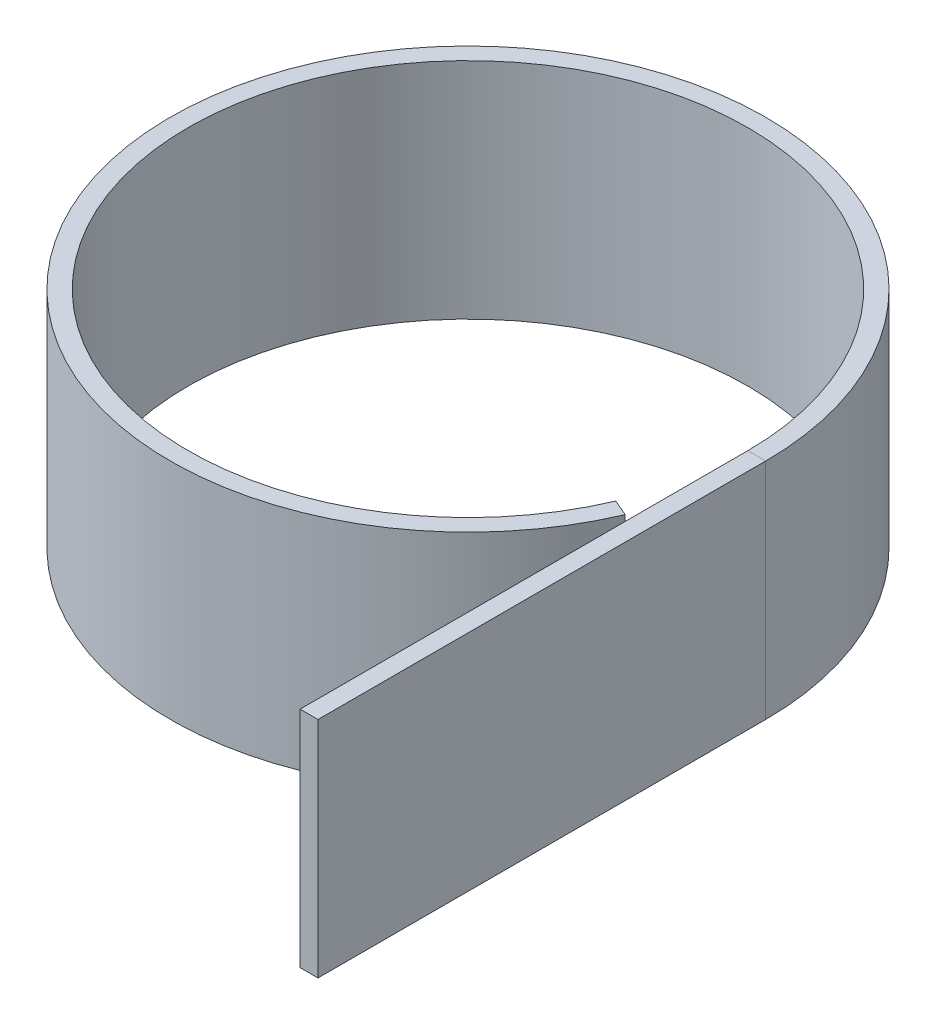
ISO-10303-21;
HEADER;
FILE_DESCRIPTION(('STEP AP214'),'2;1');
FILE_NAME('part.step','',(''),(''),'','','');
FILE_SCHEMA(('AUTOMOTIVE_DESIGN { 1 0 10303 214 1 1 1 1 }'));
ENDSEC;
DATA;
#1=APPLICATION_CONTEXT('core data for automotive mechanical design processes');
#2=APPLICATION_PROTOCOL_DEFINITION('international standard','automotive_design',2000,#1);
#3=PRODUCT_CONTEXT('',#1,'mechanical');
#4=PRODUCT('Part','Part','',(#3));
#5=PRODUCT_RELATED_PRODUCT_CATEGORY('part','',(#4));
#6=PRODUCT_DEFINITION_FORMATION('','',#4);
#7=PRODUCT_DEFINITION_CONTEXT('part definition',#1,'design');
#8=PRODUCT_DEFINITION('design','',#6,#7);
#9=PRODUCT_DEFINITION_SHAPE('','',#8);
#10=(LENGTH_UNIT() NAMED_UNIT(*) SI_UNIT(.MILLI.,.METRE.));
#11=(NAMED_UNIT(*) PLANE_ANGLE_UNIT() SI_UNIT($,.RADIAN.));
#12=(NAMED_UNIT(*) SI_UNIT($,.STERADIAN.) SOLID_ANGLE_UNIT());
#13=UNCERTAINTY_MEASURE_WITH_UNIT(LENGTH_MEASURE(1.E-05),#10,'distance_accuracy_value','');
#14=(GEOMETRIC_REPRESENTATION_CONTEXT(3) GLOBAL_UNCERTAINTY_ASSIGNED_CONTEXT((#13)) GLOBAL_UNIT_ASSIGNED_CONTEXT((#10,
#11,#12)) REPRESENTATION_CONTEXT('',''));
#15=CARTESIAN_POINT('',(0.,0.,0.));
#16=DIRECTION('',(0.,0.,1.));
#17=DIRECTION('',(1.,0.,0.));
#18=AXIS2_PLACEMENT_3D('',#15,#16,#17);
#19=CARTESIAN_POINT('',(0.8,10.,-20.));
#20=DIRECTION('',(0.,1.,0.));
#21=DIRECTION('',(0.,0.,1.));
#22=AXIS2_PLACEMENT_3D('',#19,#20,#21);
#23=PLANE('',#22);
#24=DIRECTION('',(-1.,0.,0.));
#25=VECTOR('',#24,1.);
#26=CARTESIAN_POINT('',(0.8,10.,-20.));
#27=LINE('',#26,#25);
#28=CARTESIAN_POINT('',(0.8,10.,-20.));
#29=VERTEX_POINT('',#28);
#30=CARTESIAN_POINT('',(0.,10.,-20.));
#31=VERTEX_POINT('',#30);
#32=EDGE_CURVE('E11',#29,#31,#27,.T.);
#33=ORIENTED_EDGE('',*,*,#32,.F.);
#34=CARTESIAN_POINT('',(-12.5,10.,-20.));
#35=DIRECTION('',(0.,1.,0.));
#36=DIRECTION('',(1.,0.,0.));
#37=AXIS2_PLACEMENT_3D('',#34,#35,#36);
#38=CIRCLE('',#37,13.3);
#39=CARTESIAN_POINT('',(-0.264000000000002,10.,-14.7874858273574));
#40=VERTEX_POINT('',#39);
#41=EDGE_CURVE('E84',#29,#40,#38,.T.);
#42=ORIENTED_EDGE('',*,*,#41,.T.);
#43=DIRECTION('',(0.919999999999998,0.,0.391918358845313));
#44=VECTOR('',#43,1.);
#45=CARTESIAN_POINT('',(-1.,10.,-15.1010205144336));
#46=LINE('',#45,#44);
#47=CARTESIAN_POINT('',(-1.,10.,-15.1010205144336));
#48=VERTEX_POINT('',#47);
#49=EDGE_CURVE('E145',#48,#40,#46,.T.);
#50=ORIENTED_EDGE('',*,*,#49,.F.);
#51=CARTESIAN_POINT('',(-12.5,10.,-20.));
#52=DIRECTION('',(0.,1.,0.));
#53=DIRECTION('',(0.,0.,1.));
#54=AXIS2_PLACEMENT_3D('',#51,#52,#53);
#55=CIRCLE('',#54,12.5);
#56=EDGE_CURVE('E111',#31,#48,#55,.T.);
#57=ORIENTED_EDGE('',*,*,#56,.F.);
#58=EDGE_LOOP('',(#33,#42,#50,#57));
#59=FACE_BOUND('',#58,.T.);
#60=ADVANCED_FACE('F37',(#59),#23,.T.);
#61=CARTESIAN_POINT('',(0.,0.,-20.));
#62=DIRECTION('',(0.,-1.,0.));
#63=DIRECTION('',(0.,0.,-1.));
#64=AXIS2_PLACEMENT_3D('',#61,#62,#63);
#65=PLANE('',#64);
#66=DIRECTION('',(1.,0.,0.));
#67=VECTOR('',#66,1.);
#68=CARTESIAN_POINT('',(0.,0.,-20.));
#69=LINE('',#68,#67);
#70=CARTESIAN_POINT('',(0.,0.,-20.));
#71=VERTEX_POINT('',#70);
#72=CARTESIAN_POINT('',(0.8,0.,-20.));
#73=VERTEX_POINT('',#72);
#74=EDGE_CURVE('E45',#71,#73,#69,.T.);
#75=ORIENTED_EDGE('',*,*,#74,.F.);
#76=CARTESIAN_POINT('',(-12.5,0.,-20.));
#77=DIRECTION('',(0.,1.,0.));
#78=DIRECTION('',(0.,0.,1.));
#79=AXIS2_PLACEMENT_3D('',#76,#77,#78);
#80=CIRCLE('',#79,12.5);
#81=CARTESIAN_POINT('',(-1.,0.,-15.1010205144336));
#82=VERTEX_POINT('',#81);
#83=EDGE_CURVE('E126',#71,#82,#80,.T.);
#84=ORIENTED_EDGE('',*,*,#83,.T.);
#85=DIRECTION('',(0.919999999999998,0.,0.391918358845313));
#86=VECTOR('',#85,1.);
#87=CARTESIAN_POINT('',(-1.,0.,-15.1010205144336));
#88=LINE('',#87,#86);
#89=CARTESIAN_POINT('',(-0.264000000000002,0.,-14.7874858273574));
#90=VERTEX_POINT('',#89);
#91=EDGE_CURVE('E123',#82,#90,#88,.T.);
#92=ORIENTED_EDGE('',*,*,#91,.T.);
#93=CARTESIAN_POINT('',(-12.5,0.,-20.));
#94=DIRECTION('',(0.,1.,0.));
#95=DIRECTION('',(1.,0.,0.));
#96=AXIS2_PLACEMENT_3D('',#93,#94,#95);
#97=CIRCLE('',#96,13.3);
#98=EDGE_CURVE('E120',#73,#90,#97,.T.);
#99=ORIENTED_EDGE('',*,*,#98,.F.);
#100=EDGE_LOOP('',(#75,#84,#92,#99));
#101=FACE_BOUND('',#100,.T.);
#102=ADVANCED_FACE('F151',(#101),#65,.T.);
#103=CARTESIAN_POINT('',(-12.5,10.,-20.));
#104=DIRECTION('',(0.,-1.,0.));
#105=DIRECTION('',(0.,0.,-1.));
#106=AXIS2_PLACEMENT_3D('',#103,#104,#105);
#107=CYLINDRICAL_SURFACE('',#106,13.3);
#108=ORIENTED_EDGE('',*,*,#98,.T.);
#109=DIRECTION('',(0.,-1.,0.));
#110=VECTOR('',#109,1.);
#111=CARTESIAN_POINT('',(-0.264000000000002,10.,-14.7874858273574));
#112=LINE('',#111,#110);
#113=EDGE_CURVE('E140',#40,#90,#112,.T.);
#114=ORIENTED_EDGE('',*,*,#113,.F.);
#115=ORIENTED_EDGE('',*,*,#41,.F.);
#116=DIRECTION('',(0.,-1.,0.));
#117=VECTOR('',#116,1.);
#118=CARTESIAN_POINT('',(0.8,10.,-20.));
#119=LINE('',#118,#117);
#120=EDGE_CURVE('E116',#29,#73,#119,.T.);
#121=ORIENTED_EDGE('',*,*,#120,.T.);
#122=EDGE_LOOP('',(#108,#114,#115,#121));
#123=FACE_BOUND('',#122,.T.);
#124=ADVANCED_FACE('F148',(#123),#107,.T.);
#125=CARTESIAN_POINT('',(-1.,10.,-15.1010205144336));
#126=DIRECTION('',(0.391918358845313,0.,-0.919999999999998));
#127=DIRECTION('',(-0.919999999999998,0.,-0.391918358845313));
#128=AXIS2_PLACEMENT_3D('',#125,#126,#127);
#129=PLANE('',#128);
#130=ORIENTED_EDGE('',*,*,#91,.F.);
#131=DIRECTION('',(0.,-1.,0.));
#132=VECTOR('',#131,1.);
#133=CARTESIAN_POINT('',(-1.,10.,-15.1010205144336));
#134=LINE('',#133,#132);
#135=EDGE_CURVE('E138',#48,#82,#134,.T.);
#136=ORIENTED_EDGE('',*,*,#135,.F.);
#137=ORIENTED_EDGE('',*,*,#49,.T.);
#138=ORIENTED_EDGE('',*,*,#113,.T.);
#139=EDGE_LOOP('',(#130,#136,#137,#138));
#140=FACE_BOUND('',#139,.T.);
#141=ADVANCED_FACE('F144',(#140),#129,.T.);
#142=CARTESIAN_POINT('',(-12.5,10.,-20.));
#143=DIRECTION('',(0.,-1.,0.));
#144=DIRECTION('',(0.,0.,-1.));
#145=AXIS2_PLACEMENT_3D('',#142,#143,#144);
#146=CYLINDRICAL_SURFACE('',#145,12.5);
#147=ORIENTED_EDGE('',*,*,#83,.F.);
#148=DIRECTION('',(0.,-1.,0.));
#149=VECTOR('',#148,1.);
#150=CARTESIAN_POINT('',(0.,10.,-20.));
#151=LINE('',#150,#149);
#152=EDGE_CURVE('E104',#31,#71,#151,.T.);
#153=ORIENTED_EDGE('',*,*,#152,.F.);
#154=ORIENTED_EDGE('',*,*,#56,.T.);
#155=ORIENTED_EDGE('',*,*,#135,.T.);
#156=EDGE_LOOP('',(#147,#153,#154,#155));
#157=FACE_BOUND('',#156,.T.);
#158=ADVANCED_FACE('F154',(#157),#146,.F.);
#159=CARTESIAN_POINT('',(0.,10.,0.));
#160=DIRECTION('',(-1.,0.,0.));
#161=DIRECTION('',(0.,0.,1.));
#162=AXIS2_PLACEMENT_3D('',#159,#160,#161);
#163=PLANE('',#162);
#164=DIRECTION('',(0.,0.,-1.));
#165=VECTOR('',#164,1.);
#166=CARTESIAN_POINT('',(0.,0.,0.));
#167=LINE('',#166,#165);
#168=CARTESIAN_POINT('',(0.,0.,0.));
#169=VERTEX_POINT('',#168);
#170=EDGE_CURVE('E99',#169,#71,#167,.T.);
#171=ORIENTED_EDGE('',*,*,#170,.F.);
#172=DIRECTION('',(0.,-1.,0.));
#173=VECTOR('',#172,1.);
#174=CARTESIAN_POINT('',(0.,10.,0.));
#175=LINE('',#174,#173);
#176=CARTESIAN_POINT('',(0.,10.,0.));
#177=VERTEX_POINT('',#176);
#178=EDGE_CURVE('E94',#177,#169,#175,.T.);
#179=ORIENTED_EDGE('',*,*,#178,.F.);
#180=DIRECTION('',(0.,0.,-1.));
#181=VECTOR('',#180,1.);
#182=CARTESIAN_POINT('',(0.,10.,0.));
#183=LINE('',#182,#181);
#184=EDGE_CURVE('E98',#177,#31,#183,.T.);
#185=ORIENTED_EDGE('',*,*,#184,.T.);
#186=ORIENTED_EDGE('',*,*,#152,.T.);
#187=EDGE_LOOP('',(#171,#179,#185,#186));
#188=FACE_BOUND('',#187,.T.);
#189=ADVANCED_FACE('F96',(#188),#163,.T.);
#190=CARTESIAN_POINT('',(0.8,10.,0.));
#191=DIRECTION('',(0.,0.,1.));
#192=DIRECTION('',(1.,0.,0.));
#193=AXIS2_PLACEMENT_3D('',#190,#191,#192);
#194=PLANE('',#193);
#195=DIRECTION('',(-1.,0.,0.));
#196=VECTOR('',#195,1.);
#197=CARTESIAN_POINT('',(0.8,0.,0.));
#198=LINE('',#197,#196);
#199=CARTESIAN_POINT('',(0.8,0.,0.));
#200=VERTEX_POINT('',#199);
#201=EDGE_CURVE('E130',#200,#169,#198,.T.);
#202=ORIENTED_EDGE('',*,*,#201,.F.);
#203=DIRECTION('',(0.,-1.,0.));
#204=VECTOR('',#203,1.);
#205=CARTESIAN_POINT('',(0.8,10.,0.));
#206=LINE('',#205,#204);
#207=CARTESIAN_POINT('',(0.8,10.,0.));
#208=VERTEX_POINT('',#207);
#209=EDGE_CURVE('E74',#208,#200,#206,.T.);
#210=ORIENTED_EDGE('',*,*,#209,.F.);
#211=DIRECTION('',(-1.,0.,0.));
#212=VECTOR('',#211,1.);
#213=CARTESIAN_POINT('',(0.8,10.,0.));
#214=LINE('',#213,#212);
#215=EDGE_CURVE('E109',#208,#177,#214,.T.);
#216=ORIENTED_EDGE('',*,*,#215,.T.);
#217=ORIENTED_EDGE('',*,*,#178,.T.);
#218=EDGE_LOOP('',(#202,#210,#216,#217));
#219=FACE_BOUND('',#218,.T.);
#220=ADVANCED_FACE('F113',(#219),#194,.T.);
#221=CARTESIAN_POINT('',(0.8,10.,0.));
#222=DIRECTION('',(-1.,0.,0.));
#223=DIRECTION('',(0.,0.,1.));
#224=AXIS2_PLACEMENT_3D('',#221,#222,#223);
#225=PLANE('',#224);
#226=DIRECTION('',(0.,0.,-1.));
#227=VECTOR('',#226,1.);
#228=CARTESIAN_POINT('',(0.8,0.,0.));
#229=LINE('',#228,#227);
#230=EDGE_CURVE('E132',#200,#73,#229,.T.);
#231=ORIENTED_EDGE('',*,*,#230,.T.);
#232=ORIENTED_EDGE('',*,*,#120,.F.);
#233=DIRECTION('',(0.,0.,-1.));
#234=VECTOR('',#233,1.);
#235=CARTESIAN_POINT('',(0.8,10.,0.));
#236=LINE('',#235,#234);
#237=EDGE_CURVE('E114',#208,#29,#236,.T.);
#238=ORIENTED_EDGE('',*,*,#237,.F.);
#239=ORIENTED_EDGE('',*,*,#209,.T.);
#240=EDGE_LOOP('',(#231,#232,#238,#239));
#241=FACE_BOUND('',#240,.T.);
#242=ADVANCED_FACE('F157',(#241),#225,.F.);
#243=CARTESIAN_POINT('',(-12.5,10.,-20.));
#244=DIRECTION('',(0.,1.,0.));
#245=DIRECTION('',(1.,0.,0.));
#246=AXIS2_PLACEMENT_3D('',#243,#244,#245);
#247=PLANE('',#246);
#248=ORIENTED_EDGE('',*,*,#237,.T.);
#249=ORIENTED_EDGE('',*,*,#32,.T.);
#250=ORIENTED_EDGE('',*,*,#184,.F.);
#251=ORIENTED_EDGE('',*,*,#215,.F.);
#252=EDGE_LOOP('',(#248,#249,#250,#251));
#253=FACE_BOUND('',#252,.T.);
#254=ADVANCED_FACE('F108',(#253),#247,.T.);
#255=CARTESIAN_POINT('',(-12.5,0.,-20.));
#256=DIRECTION('',(0.,1.,0.));
#257=DIRECTION('',(1.,0.,0.));
#258=AXIS2_PLACEMENT_3D('',#255,#256,#257);
#259=PLANE('',#258);
#260=ORIENTED_EDGE('',*,*,#170,.T.);
#261=ORIENTED_EDGE('',*,*,#74,.T.);
#262=ORIENTED_EDGE('',*,*,#230,.F.);
#263=ORIENTED_EDGE('',*,*,#201,.T.);
#264=EDGE_LOOP('',(#260,#261,#262,#263));
#265=FACE_BOUND('',#264,.T.);
#266=ADVANCED_FACE('F156',(#265),#259,.F.);
#267=CLOSED_SHELL('',(#60,#102,#124,#141,#158,#189,#220,#242,#254,#266));
#268=MANIFOLD_SOLID_BREP('B2',#267);
#269=ADVANCED_BREP_SHAPE_REPRESENTATION('',(#18,#268),#14);
#270=SHAPE_DEFINITION_REPRESENTATION(#9,#269);
ENDSEC;
END-ISO-10303-21;
